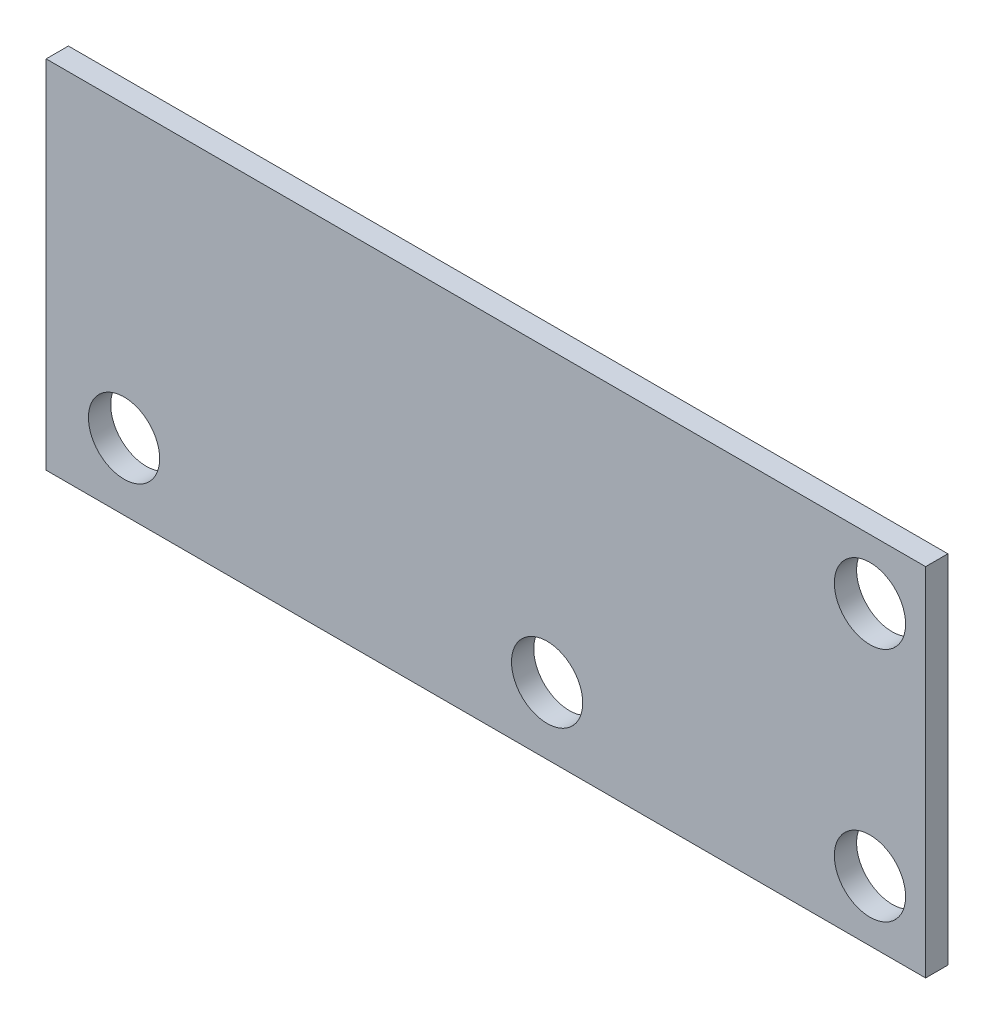
ISO-10303-21;
HEADER;
FILE_DESCRIPTION(('STEP AP214'),'2;1');
FILE_NAME('part.step','',(''),(''),'','','');
FILE_SCHEMA(('AUTOMOTIVE_DESIGN { 1 0 10303 214 1 1 1 1 }'));
ENDSEC;
DATA;
#1=APPLICATION_CONTEXT('core data for automotive mechanical design processes');
#2=APPLICATION_PROTOCOL_DEFINITION('international standard','automotive_design',2000,#1);
#3=PRODUCT_CONTEXT('',#1,'mechanical');
#4=PRODUCT('Part','Part','',(#3));
#5=PRODUCT_RELATED_PRODUCT_CATEGORY('part','',(#4));
#6=PRODUCT_DEFINITION_FORMATION('','',#4);
#7=PRODUCT_DEFINITION_CONTEXT('part definition',#1,'design');
#8=PRODUCT_DEFINITION('design','',#6,#7);
#9=PRODUCT_DEFINITION_SHAPE('','',#8);
#10=(LENGTH_UNIT() NAMED_UNIT(*) SI_UNIT(.MILLI.,.METRE.));
#11=(NAMED_UNIT(*) PLANE_ANGLE_UNIT() SI_UNIT($,.RADIAN.));
#12=(NAMED_UNIT(*) SI_UNIT($,.STERADIAN.) SOLID_ANGLE_UNIT());
#13=UNCERTAINTY_MEASURE_WITH_UNIT(LENGTH_MEASURE(1.E-05),#10,'distance_accuracy_value','');
#14=(GEOMETRIC_REPRESENTATION_CONTEXT(3) GLOBAL_UNCERTAINTY_ASSIGNED_CONTEXT((#13)) GLOBAL_UNIT_ASSIGNED_CONTEXT((#10,
#11,#12)) REPRESENTATION_CONTEXT('',''));
#15=CARTESIAN_POINT('',(0.,0.,0.));
#16=DIRECTION('',(0.,0.,1.));
#17=DIRECTION('',(1.,0.,0.));
#18=AXIS2_PLACEMENT_3D('',#15,#16,#17);
#19=CARTESIAN_POINT('',(-18.75,-5.,1.));
#20=DIRECTION('',(1.,0.,0.));
#21=DIRECTION('',(0.,0.,-1.));
#22=AXIS2_PLACEMENT_3D('',#19,#20,#21);
#23=PLANE('',#22);
#24=DIRECTION('',(0.,1.,0.));
#25=VECTOR('',#24,1.);
#26=CARTESIAN_POINT('',(-18.75,0.,1.));
#27=LINE('',#26,#25);
#28=CARTESIAN_POINT('',(-18.75,8.,1.));
#29=VERTEX_POINT('',#28);
#30=CARTESIAN_POINT('',(-18.75,-8.,1.));
#31=VERTEX_POINT('',#30);
#32=EDGE_CURVE('E74',#29,#31,#27,.F.);
#33=ORIENTED_EDGE('',*,*,#32,.F.);
#34=DIRECTION('',(0.,0.,-1.));
#35=VECTOR('',#34,1.);
#36=CARTESIAN_POINT('',(-18.75,8.,1.));
#37=LINE('',#36,#35);
#38=CARTESIAN_POINT('',(-18.75,8.,0.));
#39=VERTEX_POINT('',#38);
#40=EDGE_CURVE('E73',#39,#29,#37,.F.);
#41=ORIENTED_EDGE('',*,*,#40,.F.);
#42=DIRECTION('',(0.,1.,0.));
#43=VECTOR('',#42,1.);
#44=CARTESIAN_POINT('',(-18.75,0.,0.));
#45=LINE('',#44,#43);
#46=CARTESIAN_POINT('',(-18.75,-8.,0.));
#47=VERTEX_POINT('',#46);
#48=EDGE_CURVE('E61',#47,#39,#45,.T.);
#49=ORIENTED_EDGE('',*,*,#48,.F.);
#50=DIRECTION('',(0.,0.,1.));
#51=VECTOR('',#50,1.);
#52=CARTESIAN_POINT('',(-18.75,-8.,1.));
#53=LINE('',#52,#51);
#54=EDGE_CURVE('E55',#31,#47,#53,.F.);
#55=ORIENTED_EDGE('',*,*,#54,.F.);
#56=EDGE_LOOP('',(#33,#41,#49,#55));
#57=FACE_BOUND('',#56,.T.);
#58=ADVANCED_FACE('F16',(#57),#23,.F.);
#59=CARTESIAN_POINT('',(-12.25,-8.,1.));
#60=DIRECTION('',(0.,1.,0.));
#61=DIRECTION('',(0.,0.,1.));
#62=AXIS2_PLACEMENT_3D('',#59,#60,#61);
#63=PLANE('',#62);
#64=DIRECTION('',(-1.,0.,0.));
#65=VECTOR('',#64,1.);
#66=CARTESIAN_POINT('',(0.,-8.,1.));
#67=LINE('',#66,#65);
#68=CARTESIAN_POINT('',(20.75,-8.,1.));
#69=VERTEX_POINT('',#68);
#70=EDGE_CURVE('E111',#31,#69,#67,.F.);
#71=ORIENTED_EDGE('',*,*,#70,.F.);
#72=ORIENTED_EDGE('',*,*,#54,.T.);
#73=DIRECTION('',(-1.,0.,0.));
#74=VECTOR('',#73,1.);
#75=CARTESIAN_POINT('',(0.,-8.,0.));
#76=LINE('',#75,#74);
#77=CARTESIAN_POINT('',(20.75,-8.,0.));
#78=VERTEX_POINT('',#77);
#79=EDGE_CURVE('E68',#78,#47,#76,.T.);
#80=ORIENTED_EDGE('',*,*,#79,.F.);
#81=DIRECTION('',(0.,0.,1.));
#82=VECTOR('',#81,1.);
#83=CARTESIAN_POINT('',(20.75,-8.,1.));
#84=LINE('',#83,#82);
#85=EDGE_CURVE('E77',#69,#78,#84,.F.);
#86=ORIENTED_EDGE('',*,*,#85,.F.);
#87=EDGE_LOOP('',(#71,#72,#80,#86));
#88=FACE_BOUND('',#87,.T.);
#89=ADVANCED_FACE('F116',(#88),#63,.F.);
#90=CARTESIAN_POINT('',(20.75,-5.,1.));
#91=DIRECTION('',(-1.,0.,0.));
#92=DIRECTION('',(0.,0.,1.));
#93=AXIS2_PLACEMENT_3D('',#90,#91,#92);
#94=PLANE('',#93);
#95=DIRECTION('',(0.,1.,0.));
#96=VECTOR('',#95,1.);
#97=CARTESIAN_POINT('',(20.75,0.,1.));
#98=LINE('',#97,#96);
#99=CARTESIAN_POINT('',(20.75,8.,1.));
#100=VERTEX_POINT('',#99);
#101=EDGE_CURVE('E34',#69,#100,#98,.T.);
#102=ORIENTED_EDGE('',*,*,#101,.F.);
#103=ORIENTED_EDGE('',*,*,#85,.T.);
#104=DIRECTION('',(0.,1.,0.));
#105=VECTOR('',#104,1.);
#106=CARTESIAN_POINT('',(20.75,0.,0.));
#107=LINE('',#106,#105);
#108=CARTESIAN_POINT('',(20.75,8.,0.));
#109=VERTEX_POINT('',#108);
#110=EDGE_CURVE('E80',#109,#78,#107,.F.);
#111=ORIENTED_EDGE('',*,*,#110,.F.);
#112=DIRECTION('',(0.,0.,-1.));
#113=VECTOR('',#112,1.);
#114=CARTESIAN_POINT('',(20.75,8.,1.));
#115=LINE('',#114,#113);
#116=EDGE_CURVE('E70',#100,#109,#115,.T.);
#117=ORIENTED_EDGE('',*,*,#116,.F.);
#118=EDGE_LOOP('',(#102,#103,#111,#117));
#119=FACE_BOUND('',#118,.T.);
#120=ADVANCED_FACE('F118',(#119),#94,.F.);
#121=CARTESIAN_POINT('',(-12.25,8.,1.));
#122=DIRECTION('',(0.,-1.,0.));
#123=DIRECTION('',(0.,0.,-1.));
#124=AXIS2_PLACEMENT_3D('',#121,#122,#123);
#125=PLANE('',#124);
#126=DIRECTION('',(-1.,0.,0.));
#127=VECTOR('',#126,1.);
#128=CARTESIAN_POINT('',(0.,8.,1.));
#129=LINE('',#128,#127);
#130=EDGE_CURVE('E99',#100,#29,#129,.T.);
#131=ORIENTED_EDGE('',*,*,#130,.F.);
#132=ORIENTED_EDGE('',*,*,#116,.T.);
#133=DIRECTION('',(-1.,0.,0.));
#134=VECTOR('',#133,1.);
#135=CARTESIAN_POINT('',(0.,8.,0.));
#136=LINE('',#135,#134);
#137=EDGE_CURVE('E66',#39,#109,#136,.F.);
#138=ORIENTED_EDGE('',*,*,#137,.F.);
#139=ORIENTED_EDGE('',*,*,#40,.T.);
#140=EDGE_LOOP('',(#131,#132,#138,#139));
#141=FACE_BOUND('',#140,.T.);
#142=ADVANCED_FACE('F79',(#141),#125,.F.);
#143=CARTESIAN_POINT('',(18.2503989695914,5.31473421814042,0.));
#144=DIRECTION('',(0.,0.,1.));
#145=DIRECTION('',(1.,0.,0.));
#146=AXIS2_PLACEMENT_3D('',#143,#144,#145);
#147=CYLINDRICAL_SURFACE('',#146,1.6);
#148=CARTESIAN_POINT('',(18.2503989695914,5.31473421814042,1.));
#149=DIRECTION('',(0.,0.,1.));
#150=DIRECTION('',(1.,0.,0.));
#151=AXIS2_PLACEMENT_3D('',#148,#149,#150);
#152=CIRCLE('',#151,1.6);
#153=CARTESIAN_POINT('',(19.8503989695914,5.31473421814042,1.));
#154=VERTEX_POINT('',#153);
#155=EDGE_CURVE('E96',#154,#154,#152,.F.);
#156=ORIENTED_EDGE('',*,*,#155,.F.);
#157=EDGE_LOOP('',(#156));
#158=FACE_BOUND('',#157,.T.);
#159=CARTESIAN_POINT('',(18.2503989695914,5.31473421814042,0.));
#160=DIRECTION('',(0.,0.,1.));
#161=DIRECTION('',(1.,0.,0.));
#162=AXIS2_PLACEMENT_3D('',#159,#160,#161);
#163=CIRCLE('',#162,1.6);
#164=CARTESIAN_POINT('',(19.8503989695914,5.31473421814042,0.));
#165=VERTEX_POINT('',#164);
#166=EDGE_CURVE('E19',#165,#165,#163,.T.);
#167=ORIENTED_EDGE('',*,*,#166,.F.);
#168=EDGE_LOOP('',(#167));
#169=FACE_BOUND('',#168,.T.);
#170=ADVANCED_FACE('F126',(#158,#169),#147,.F.);
#171=CARTESIAN_POINT('',(18.2503989695914,-5.28526578185958,0.));
#172=DIRECTION('',(0.,0.,1.));
#173=DIRECTION('',(1.,0.,0.));
#174=AXIS2_PLACEMENT_3D('',#171,#172,#173);
#175=CYLINDRICAL_SURFACE('',#174,1.6);
#176=CARTESIAN_POINT('',(18.2503989695914,-5.28526578185958,1.));
#177=DIRECTION('',(0.,0.,1.));
#178=DIRECTION('',(1.,0.,0.));
#179=AXIS2_PLACEMENT_3D('',#176,#177,#178);
#180=CIRCLE('',#179,1.6);
#181=CARTESIAN_POINT('',(19.8503989695914,-5.28526578185958,1.));
#182=VERTEX_POINT('',#181);
#183=EDGE_CURVE('E93',#182,#182,#180,.F.);
#184=ORIENTED_EDGE('',*,*,#183,.F.);
#185=EDGE_LOOP('',(#184));
#186=FACE_BOUND('',#185,.T.);
#187=CARTESIAN_POINT('',(18.2503989695914,-5.28526578185958,0.));
#188=DIRECTION('',(0.,0.,1.));
#189=DIRECTION('',(1.,0.,0.));
#190=AXIS2_PLACEMENT_3D('',#187,#188,#189);
#191=CIRCLE('',#190,1.6);
#192=CARTESIAN_POINT('',(19.8503989695914,-5.28526578185958,0.));
#193=VERTEX_POINT('',#192);
#194=EDGE_CURVE('E102',#193,#193,#191,.T.);
#195=ORIENTED_EDGE('',*,*,#194,.F.);
#196=EDGE_LOOP('',(#195));
#197=FACE_BOUND('',#196,.T.);
#198=ADVANCED_FACE('F145',(#186,#197),#175,.F.);
#199=CARTESIAN_POINT('',(3.75,-5.,0.));
#200=DIRECTION('',(0.,0.,1.));
#201=DIRECTION('',(1.,0.,0.));
#202=AXIS2_PLACEMENT_3D('',#199,#200,#201);
#203=CYLINDRICAL_SURFACE('',#202,1.6);
#204=CARTESIAN_POINT('',(3.75,-5.,1.));
#205=DIRECTION('',(0.,0.,1.));
#206=DIRECTION('',(1.,0.,0.));
#207=AXIS2_PLACEMENT_3D('',#204,#205,#206);
#208=CIRCLE('',#207,1.6);
#209=CARTESIAN_POINT('',(5.35,-5.,1.));
#210=VERTEX_POINT('',#209);
#211=EDGE_CURVE('E90',#210,#210,#208,.F.);
#212=ORIENTED_EDGE('',*,*,#211,.F.);
#213=EDGE_LOOP('',(#212));
#214=FACE_BOUND('',#213,.T.);
#215=CARTESIAN_POINT('',(3.75,-5.,0.));
#216=DIRECTION('',(0.,0.,1.));
#217=DIRECTION('',(1.,0.,0.));
#218=AXIS2_PLACEMENT_3D('',#215,#216,#217);
#219=CIRCLE('',#218,1.6);
#220=CARTESIAN_POINT('',(5.35,-5.,0.));
#221=VERTEX_POINT('',#220);
#222=EDGE_CURVE('E100',#221,#221,#219,.T.);
#223=ORIENTED_EDGE('',*,*,#222,.F.);
#224=EDGE_LOOP('',(#223));
#225=FACE_BOUND('',#224,.T.);
#226=ADVANCED_FACE('F141',(#214,#225),#203,.F.);
#227=CARTESIAN_POINT('',(0.,0.,0.));
#228=DIRECTION('',(0.,0.,-1.));
#229=DIRECTION('',(-1.,0.,0.));
#230=AXIS2_PLACEMENT_3D('',#227,#228,#229);
#231=PLANE('',#230);
#232=CARTESIAN_POINT('',(-15.25,-5.,0.));
#233=DIRECTION('',(0.,0.,1.));
#234=DIRECTION('',(1.,0.,0.));
#235=AXIS2_PLACEMENT_3D('',#232,#233,#234);
#236=CIRCLE('',#235,1.6);
#237=CARTESIAN_POINT('',(-13.65,-5.,0.));
#238=VERTEX_POINT('',#237);
#239=EDGE_CURVE('E25',#238,#238,#236,.F.);
#240=ORIENTED_EDGE('',*,*,#239,.F.);
#241=EDGE_LOOP('',(#240));
#242=FACE_BOUND('',#241,.T.);
#243=ORIENTED_EDGE('',*,*,#222,.T.);
#244=EDGE_LOOP('',(#243));
#245=FACE_BOUND('',#244,.T.);
#246=ORIENTED_EDGE('',*,*,#194,.T.);
#247=EDGE_LOOP('',(#246));
#248=FACE_BOUND('',#247,.T.);
#249=ORIENTED_EDGE('',*,*,#166,.T.);
#250=EDGE_LOOP('',(#249));
#251=FACE_BOUND('',#250,.T.);
#252=ORIENTED_EDGE('',*,*,#110,.T.);
#253=ORIENTED_EDGE('',*,*,#79,.T.);
#254=ORIENTED_EDGE('',*,*,#48,.T.);
#255=ORIENTED_EDGE('',*,*,#137,.T.);
#256=EDGE_LOOP('',(#252,#253,#254,#255));
#257=FACE_BOUND('',#256,.T.);
#258=ADVANCED_FACE('F64',(#242,#245,#248,#251,#257),#231,.T.);
#259=CARTESIAN_POINT('',(0.,0.,1.));
#260=DIRECTION('',(0.,0.,-1.));
#261=DIRECTION('',(-1.,0.,0.));
#262=AXIS2_PLACEMENT_3D('',#259,#260,#261);
#263=PLANE('',#262);
#264=CARTESIAN_POINT('',(-15.25,-5.,1.));
#265=DIRECTION('',(0.,0.,1.));
#266=DIRECTION('',(1.,0.,0.));
#267=AXIS2_PLACEMENT_3D('',#264,#265,#266);
#268=CIRCLE('',#267,1.6);
#269=CARTESIAN_POINT('',(-13.65,-5.,1.));
#270=VERTEX_POINT('',#269);
#271=EDGE_CURVE('E11',#270,#270,#268,.T.);
#272=ORIENTED_EDGE('',*,*,#271,.F.);
#273=EDGE_LOOP('',(#272));
#274=FACE_BOUND('',#273,.T.);
#275=ORIENTED_EDGE('',*,*,#211,.T.);
#276=EDGE_LOOP('',(#275));
#277=FACE_BOUND('',#276,.T.);
#278=ORIENTED_EDGE('',*,*,#183,.T.);
#279=EDGE_LOOP('',(#278));
#280=FACE_BOUND('',#279,.T.);
#281=ORIENTED_EDGE('',*,*,#155,.T.);
#282=EDGE_LOOP('',(#281));
#283=FACE_BOUND('',#282,.T.);
#284=ORIENTED_EDGE('',*,*,#101,.T.);
#285=ORIENTED_EDGE('',*,*,#130,.T.);
#286=ORIENTED_EDGE('',*,*,#32,.T.);
#287=ORIENTED_EDGE('',*,*,#70,.T.);
#288=EDGE_LOOP('',(#284,#285,#286,#287));
#289=FACE_BOUND('',#288,.T.);
#290=ADVANCED_FACE('F114',(#274,#277,#280,#283,#289),#263,.F.);
#291=CARTESIAN_POINT('',(-15.25,-5.,0.));
#292=DIRECTION('',(0.,0.,1.));
#293=DIRECTION('',(1.,0.,0.));
#294=AXIS2_PLACEMENT_3D('',#291,#292,#293);
#295=CYLINDRICAL_SURFACE('',#294,1.6);
#296=ORIENTED_EDGE('',*,*,#271,.T.);
#297=EDGE_LOOP('',(#296));
#298=FACE_BOUND('',#297,.T.);
#299=ORIENTED_EDGE('',*,*,#239,.T.);
#300=EDGE_LOOP('',(#299));
#301=FACE_BOUND('',#300,.T.);
#302=ADVANCED_FACE('F128',(#298,#301),#295,.F.);
#303=CLOSED_SHELL('',(#58,#89,#120,#142,#170,#198,#226,#258,#290,#302));
#304=MANIFOLD_SOLID_BREP('B1',#303);
#305=ADVANCED_BREP_SHAPE_REPRESENTATION('',(#18,#304),#14);
#306=SHAPE_DEFINITION_REPRESENTATION(#9,#305);
ENDSEC;
END-ISO-10303-21;
